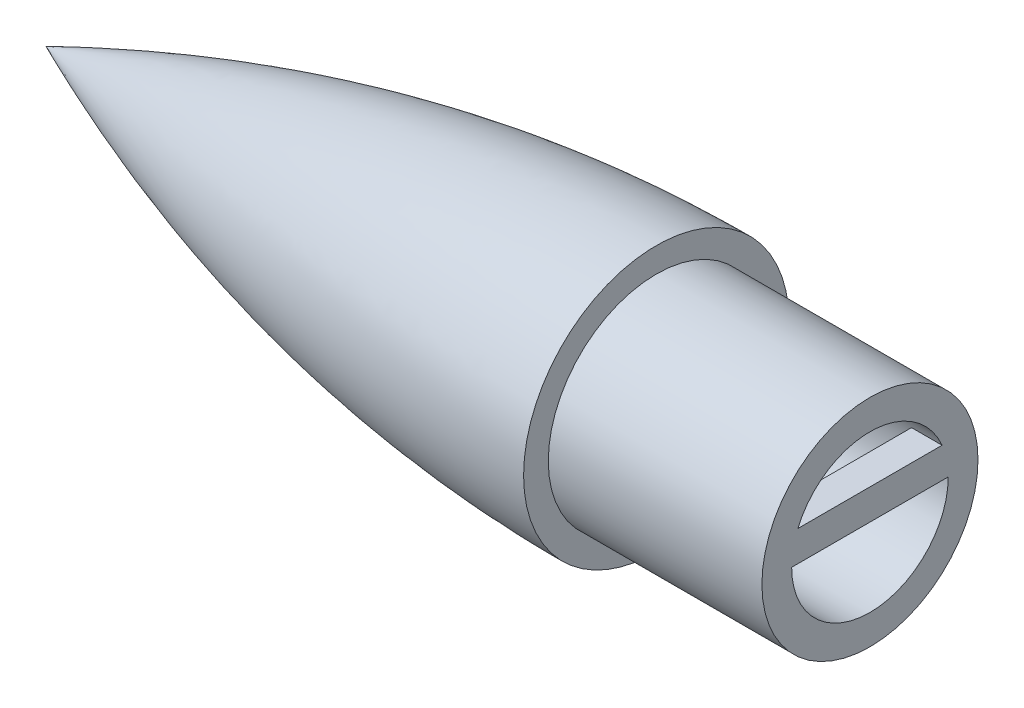
ISO-10303-21;
HEADER;
FILE_DESCRIPTION(('STEP AP214'),'2;1');
FILE_NAME('part.step','',(''),(''),'','','');
FILE_SCHEMA(('AUTOMOTIVE_DESIGN { 1 0 10303 214 1 1 1 1 }'));
ENDSEC;
DATA;
#1=APPLICATION_CONTEXT('core data for automotive mechanical design processes');
#2=APPLICATION_PROTOCOL_DEFINITION('international standard','automotive_design',2000,#1);
#3=PRODUCT_CONTEXT('',#1,'mechanical');
#4=PRODUCT('Part','Part','',(#3));
#5=PRODUCT_RELATED_PRODUCT_CATEGORY('part','',(#4));
#6=PRODUCT_DEFINITION_FORMATION('','',#4);
#7=PRODUCT_DEFINITION_CONTEXT('part definition',#1,'design');
#8=PRODUCT_DEFINITION('design','',#6,#7);
#9=PRODUCT_DEFINITION_SHAPE('','',#8);
#10=(LENGTH_UNIT() NAMED_UNIT(*) SI_UNIT(.MILLI.,.METRE.));
#11=(NAMED_UNIT(*) PLANE_ANGLE_UNIT() SI_UNIT($,.RADIAN.));
#12=(NAMED_UNIT(*) SI_UNIT($,.STERADIAN.) SOLID_ANGLE_UNIT());
#13=UNCERTAINTY_MEASURE_WITH_UNIT(LENGTH_MEASURE(1.E-05),#10,'distance_accuracy_value','');
#14=(GEOMETRIC_REPRESENTATION_CONTEXT(3) GLOBAL_UNCERTAINTY_ASSIGNED_CONTEXT((#13)) GLOBAL_UNIT_ASSIGNED_CONTEXT((#10,
#11,#12)) REPRESENTATION_CONTEXT('',''));
#15=CARTESIAN_POINT('',(0.,0.,0.));
#16=DIRECTION('',(0.,0.,1.));
#17=DIRECTION('',(1.,0.,0.));
#18=AXIS2_PLACEMENT_3D('',#15,#16,#17);
#19=CARTESIAN_POINT('',(46.9899999999181,0.,0.));
#20=DIRECTION('',(1.,0.,0.));
#21=DIRECTION('',(0.,0.,-1.));
#22=AXIS2_PLACEMENT_3D('',#19,#20,#21);
#23=CYLINDRICAL_SURFACE('',#22,6.51699999974734);
#24=CARTESIAN_POINT('',(46.9899999999181,0.,0.));
#25=DIRECTION('',(1.,0.,0.));
#26=DIRECTION('',(0.,0.,-1.));
#27=AXIS2_PLACEMENT_3D('',#24,#25,#26);
#28=CIRCLE('',#27,6.51699999974734);
#29=CARTESIAN_POINT('',(46.9899999999181,0.,-6.51699999974734));
#30=VERTEX_POINT('',#29);
#31=EDGE_CURVE('E71',#30,#30,#28,.T.);
#32=ORIENTED_EDGE('',*,*,#31,.F.);
#33=EDGE_LOOP('',(#32));
#34=FACE_BOUND('',#33,.T.);
#35=DIRECTION('',(1.,0.,0.));
#36=VECTOR('',#35,1.);
#37=CARTESIAN_POINT('',(46.9899999999181,2.54,6.00164052544859));
#38=LINE('',#37,#36);
#39=CARTESIAN_POINT('',(68.5799999999182,2.54,6.00164052544859));
#40=VERTEX_POINT('',#39);
#41=CARTESIAN_POINT('',(66.0399999999182,2.54,6.00164052544859));
#42=VERTEX_POINT('',#41);
#43=EDGE_CURVE('E78',#40,#42,#38,.F.);
#44=ORIENTED_EDGE('',*,*,#43,.T.);
#45=CARTESIAN_POINT('',(66.0399999999182,0.,0.));
#46=DIRECTION('',(1.,0.,0.));
#47=DIRECTION('',(0.,0.,-1.));
#48=AXIS2_PLACEMENT_3D('',#45,#46,#47);
#49=CIRCLE('',#48,6.51699999974734);
#50=CARTESIAN_POINT('',(66.0399999999182,0.,6.51699999974734));
#51=VERTEX_POINT('',#50);
#52=EDGE_CURVE('E82',#42,#51,#49,.T.);
#53=ORIENTED_EDGE('',*,*,#52,.T.);
#54=DIRECTION('',(1.,0.,0.));
#55=VECTOR('',#54,1.);
#56=CARTESIAN_POINT('',(46.9899999999181,0.,6.51699999974734));
#57=LINE('',#56,#55);
#58=CARTESIAN_POINT('',(68.5799999999182,0.,6.51699999974734));
#59=VERTEX_POINT('',#58);
#60=EDGE_CURVE('E127',#51,#59,#57,.T.);
#61=ORIENTED_EDGE('',*,*,#60,.T.);
#62=CARTESIAN_POINT('',(68.5799999999182,0.,0.));
#63=DIRECTION('',(1.,0.,0.));
#64=DIRECTION('',(0.,0.,-1.));
#65=AXIS2_PLACEMENT_3D('',#62,#63,#64);
#66=CIRCLE('',#65,6.51699999974734);
#67=CARTESIAN_POINT('',(68.5799999999182,0.,-6.51699999974734));
#68=VERTEX_POINT('',#67);
#69=EDGE_CURVE('E109',#59,#68,#66,.T.);
#70=ORIENTED_EDGE('',*,*,#69,.T.);
#71=DIRECTION('',(1.,0.,0.));
#72=VECTOR('',#71,1.);
#73=CARTESIAN_POINT('',(46.9899999999181,0.,-6.51699999974734));
#74=LINE('',#73,#72);
#75=CARTESIAN_POINT('',(66.0399999999182,0.,-6.51699999974734));
#76=VERTEX_POINT('',#75);
#77=EDGE_CURVE('E169',#76,#68,#74,.T.);
#78=ORIENTED_EDGE('',*,*,#77,.F.);
#79=CARTESIAN_POINT('',(66.0399999999182,0.,0.));
#80=DIRECTION('',(-1.,0.,0.));
#81=DIRECTION('',(0.,0.,1.));
#82=AXIS2_PLACEMENT_3D('',#79,#80,#81);
#83=CIRCLE('',#82,6.51699999974734);
#84=CARTESIAN_POINT('',(66.0399999999182,2.54,-6.00164052544859));
#85=VERTEX_POINT('',#84);
#86=EDGE_CURVE('E114',#85,#76,#83,.T.);
#87=ORIENTED_EDGE('',*,*,#86,.F.);
#88=DIRECTION('',(1.,0.,0.));
#89=VECTOR('',#88,1.);
#90=CARTESIAN_POINT('',(46.9899999999181,2.54,-6.00164052544859));
#91=LINE('',#90,#89);
#92=CARTESIAN_POINT('',(68.5799999999182,2.54,-6.00164052544859));
#93=VERTEX_POINT('',#92);
#94=EDGE_CURVE('E112',#93,#85,#91,.F.);
#95=ORIENTED_EDGE('',*,*,#94,.F.);
#96=EDGE_CURVE('E102',#93,#40,#66,.T.);
#97=ORIENTED_EDGE('',*,*,#96,.T.);
#98=EDGE_LOOP('',(#44,#53,#61,#70,#78,#87,#95,#97));
#99=FACE_BOUND('',#98,.T.);
#100=ADVANCED_FACE('F63',(#34,#99),#23,.F.);
#101=CARTESIAN_POINT('',(46.9899999999181,0.,0.));
#102=DIRECTION('',(1.,0.,0.));
#103=DIRECTION('',(0.,0.,-1.));
#104=AXIS2_PLACEMENT_3D('',#101,#102,#103);
#105=CYLINDRICAL_SURFACE('',#104,8.99349999974734);
#106=CARTESIAN_POINT('',(46.9899999999181,0.,0.));
#107=DIRECTION('',(1.,0.,0.));
#108=DIRECTION('',(0.,0.,-1.));
#109=AXIS2_PLACEMENT_3D('',#106,#107,#108);
#110=CIRCLE('',#109,8.99349999974734);
#111=CARTESIAN_POINT('',(46.9899999999181,0.,-8.99349999974734));
#112=VERTEX_POINT('',#111);
#113=EDGE_CURVE('E13',#112,#112,#110,.T.);
#114=CARTESIAN_POINT('',(68.5799999999182,0.,0.));
#115=DIRECTION('',(1.,0.,0.));
#116=DIRECTION('',(0.,0.,-1.));
#117=AXIS2_PLACEMENT_3D('',#114,#115,#116);
#118=CIRCLE('',#117,8.99349999974734);
#119=CARTESIAN_POINT('',(68.5799999999181,0.,-8.99349999974734));
#120=VERTEX_POINT('',#119);
#121=EDGE_CURVE('E108',#120,#120,#118,.T.);
#122=CARTESIAN_POINT('',(46.9899999999181,0.,-8.99349999974734));
#123=CARTESIAN_POINT('',(47.2148958332515,0.,-8.99349999974734));
#124=CARTESIAN_POINT('',(47.4397916665848,0.,-8.99349999974734));
#125=CARTESIAN_POINT('',(47.8895833332515,0.,-8.99349999974734));
#126=CARTESIAN_POINT('',(48.1144791665848,0.,-8.99349999974734));
#127=CARTESIAN_POINT('',(48.5642708332515,0.,-8.99349999974734));
#128=CARTESIAN_POINT('',(48.7891666665848,0.,-8.99349999974734));
#129=CARTESIAN_POINT('',(49.2389583332515,0.,-8.99349999974734));
#130=CARTESIAN_POINT('',(49.4638541665848,0.,-8.99349999974734));
#131=CARTESIAN_POINT('',(49.9136458332515,0.,-8.99349999974734));
#132=CARTESIAN_POINT('',(50.1385416665848,0.,-8.99349999974734));
#133=CARTESIAN_POINT('',(50.5883333332515,0.,-8.99349999974734));
#134=CARTESIAN_POINT('',(50.8132291665848,0.,-8.99349999974734));
#135=CARTESIAN_POINT('',(51.2630208332515,0.,-8.99349999974734));
#136=CARTESIAN_POINT('',(51.4879166665848,0.,-8.99349999974734));
#137=CARTESIAN_POINT('',(51.9377083332515,0.,-8.99349999974734));
#138=CARTESIAN_POINT('',(52.1626041665848,0.,-8.99349999974734));
#139=CARTESIAN_POINT('',(52.6123958332515,0.,-8.99349999974734));
#140=CARTESIAN_POINT('',(52.8372916665848,0.,-8.99349999974734));
#141=CARTESIAN_POINT('',(53.2870833332515,0.,-8.99349999974734));
#142=CARTESIAN_POINT('',(53.5119791665848,0.,-8.99349999974734));
#143=CARTESIAN_POINT('',(53.9617708332515,0.,-8.99349999974734));
#144=CARTESIAN_POINT('',(54.1866666665848,0.,-8.99349999974734));
#145=CARTESIAN_POINT('',(54.6364583332515,0.,-8.99349999974734));
#146=CARTESIAN_POINT('',(54.8613541665848,0.,-8.99349999974734));
#147=CARTESIAN_POINT('',(55.3111458332515,0.,-8.99349999974734));
#148=CARTESIAN_POINT('',(55.5360416665848,0.,-8.99349999974734));
#149=CARTESIAN_POINT('',(55.9858333332515,0.,-8.99349999974734));
#150=CARTESIAN_POINT('',(56.2107291665848,0.,-8.99349999974734));
#151=CARTESIAN_POINT('',(56.6605208332515,0.,-8.99349999974734));
#152=CARTESIAN_POINT('',(56.8854166665848,0.,-8.99349999974734));
#153=CARTESIAN_POINT('',(57.3352083332515,0.,-8.99349999974734));
#154=CARTESIAN_POINT('',(57.5601041665848,0.,-8.99349999974734));
#155=CARTESIAN_POINT('',(58.0098958332515,0.,-8.99349999974734));
#156=CARTESIAN_POINT('',(58.2347916665848,0.,-8.99349999974734));
#157=CARTESIAN_POINT('',(58.6845833332515,0.,-8.99349999974734));
#158=CARTESIAN_POINT('',(58.9094791665848,0.,-8.99349999974734));
#159=CARTESIAN_POINT('',(59.3592708332515,0.,-8.99349999974734));
#160=CARTESIAN_POINT('',(59.5841666665848,0.,-8.99349999974734));
#161=CARTESIAN_POINT('',(60.0339583332515,0.,-8.99349999974734));
#162=CARTESIAN_POINT('',(60.2588541665848,0.,-8.99349999974734));
#163=CARTESIAN_POINT('',(60.7086458332515,0.,-8.99349999974734));
#164=CARTESIAN_POINT('',(60.9335416665848,0.,-8.99349999974734));
#165=CARTESIAN_POINT('',(61.3833333332515,0.,-8.99349999974734));
#166=CARTESIAN_POINT('',(61.6082291665848,0.,-8.99349999974734));
#167=CARTESIAN_POINT('',(62.0580208332515,0.,-8.99349999974734));
#168=CARTESIAN_POINT('',(62.2829166665848,0.,-8.99349999974734));
#169=CARTESIAN_POINT('',(62.7327083332515,0.,-8.99349999974734));
#170=CARTESIAN_POINT('',(62.9576041665848,0.,-8.99349999974734));
#171=CARTESIAN_POINT('',(63.4073958332515,0.,-8.99349999974734));
#172=CARTESIAN_POINT('',(63.6322916665848,0.,-8.99349999974734));
#173=CARTESIAN_POINT('',(64.0820833332515,0.,-8.99349999974734));
#174=CARTESIAN_POINT('',(64.3069791665848,0.,-8.99349999974734));
#175=CARTESIAN_POINT('',(64.7567708332515,0.,-8.99349999974734));
#176=CARTESIAN_POINT('',(64.9816666665848,0.,-8.99349999974734));
#177=CARTESIAN_POINT('',(65.4314583332515,0.,-8.99349999974734));
#178=CARTESIAN_POINT('',(65.6563541665848,0.,-8.99349999974734));
#179=CARTESIAN_POINT('',(66.1061458332515,0.,-8.99349999974734));
#180=CARTESIAN_POINT('',(66.3310416665848,0.,-8.99349999974734));
#181=CARTESIAN_POINT('',(66.7808333332515,0.,-8.99349999974734));
#182=CARTESIAN_POINT('',(67.0057291665848,0.,-8.99349999974734));
#183=CARTESIAN_POINT('',(67.4555208332515,0.,-8.99349999974734));
#184=CARTESIAN_POINT('',(67.6804166665848,0.,-8.99349999974734));
#185=CARTESIAN_POINT('',(68.1302083332515,0.,-8.99349999974734));
#186=CARTESIAN_POINT('',(68.3551041665848,0.,-8.99349999974734));
#187=CARTESIAN_POINT('',(68.5799999999181,0.,-8.99349999974734));
#188=B_SPLINE_CURVE_WITH_KNOTS('',3,(#122,#123,#124,#125,#126,#127,#128,#129,#130,#131,#132,
#133,#134,#135,#136,#137,#138,#139,#140,#141,#142,#143,#144,#145,#146,#147,#148,#149,#150,#151,
#152,#153,#154,#155,#156,#157,#158,#159,#160,#161,#162,#163,#164,#165,#166,#167,#168,#169,#170,
#171,#172,#173,#174,#175,#176,#177,#178,#179,#180,#181,#182,#183,#184,#185,#186,#187),
.UNSPECIFIED.,.F.,.F.,(4,2,2,2,2,2,2,2,2,2,2,2,2,2,2,2,2,2,2,2,2,2,2,2,2,2,2,2,2,2,2,2,4),(0.,
0.674687500000007,1.349375,2.02406250000001,2.69875,3.37343750000001,4.048125,4.72281250000001,
5.3975,6.07218750000001,6.746875,7.42156250000001,8.09625,8.77093750000001,9.445625,10.1203125,
10.795,11.4696875,12.144375,12.8190625,13.49375,14.1684375,14.843125,15.5178125,16.1925,
16.8671875,17.541875,18.2165625,18.89125,19.5659375,20.240625,20.9153125,21.59),.UNSPECIFIED.);
#189=EDGE_CURVE('BSEAM65',#112,#120,#188,.T.);
#190=ORIENTED_EDGE('',*,*,#113,.T.);
#191=ORIENTED_EDGE('',*,*,#121,.F.);
#192=ORIENTED_EDGE('',*,*,#189,.T.);
#193=ORIENTED_EDGE('',*,*,#189,.F.);
#194=EDGE_LOOP('',(#190,#192,#191,#193));
#195=FACE_BOUND('',#194,.T.);
#196=ADVANCED_FACE('F65',(#195),#105,.T.);
#197=CARTESIAN_POINT('',(46.9899999999181,0.,0.));
#198=DIRECTION('',(1.,0.,0.));
#199=DIRECTION('',(0.,0.,-1.));
#200=AXIS2_PLACEMENT_3D('',#197,#198,#199);
#201=PLANE('',#200);
#202=ORIENTED_EDGE('',*,*,#31,.T.);
#203=EDGE_LOOP('',(#202));
#204=FACE_BOUND('',#203,.T.);
#205=ORIENTED_EDGE('',*,*,#113,.F.);
#206=EDGE_LOOP('',(#205));
#207=FACE_BOUND('',#206,.T.);
#208=ADVANCED_FACE('F133',(#204,#207),#201,.F.);
#209=CARTESIAN_POINT('',(68.5799999999182,0.,0.));
#210=DIRECTION('',(1.,0.,0.));
#211=DIRECTION('',(0.,0.,-1.));
#212=AXIS2_PLACEMENT_3D('',#209,#210,#211);
#213=PLANE('',#212);
#214=DIRECTION('',(0.,0.,-1.));
#215=VECTOR('',#214,1.);
#216=CARTESIAN_POINT('',(68.5799999999182,2.54,11.0499999997905));
#217=LINE('',#216,#215);
#218=EDGE_CURVE('E107',#40,#93,#217,.T.);
#219=ORIENTED_EDGE('',*,*,#218,.F.);
#220=ORIENTED_EDGE('',*,*,#96,.F.);
#221=EDGE_LOOP('',(#219,#220));
#222=FACE_BOUND('',#221,.T.);
#223=ORIENTED_EDGE('',*,*,#121,.T.);
#224=EDGE_LOOP('',(#223));
#225=FACE_BOUND('',#224,.T.);
#226=ORIENTED_EDGE('',*,*,#69,.F.);
#227=DIRECTION('',(0.,0.,-1.));
#228=VECTOR('',#227,1.);
#229=CARTESIAN_POINT('',(68.5799999999182,0.,11.0499999997905));
#230=LINE('',#229,#228);
#231=EDGE_CURVE('E168',#59,#68,#230,.T.);
#232=ORIENTED_EDGE('',*,*,#231,.T.);
#233=EDGE_LOOP('',(#226,#232));
#234=FACE_BOUND('',#233,.T.);
#235=ADVANCED_FACE('F104',(#222,#225,#234),#213,.T.);
#236=CARTESIAN_POINT('',(68.5799999999182,2.54,11.0499999997905));
#237=DIRECTION('',(0.,-1.,0.));
#238=DIRECTION('',(1.,0.,0.));
#239=AXIS2_PLACEMENT_3D('',#236,#237,#238);
#240=PLANE('',#239);
#241=ORIENTED_EDGE('',*,*,#43,.F.);
#242=ORIENTED_EDGE('',*,*,#218,.T.);
#243=ORIENTED_EDGE('',*,*,#94,.T.);
#244=DIRECTION('',(0.,0.,-1.));
#245=VECTOR('',#244,1.);
#246=CARTESIAN_POINT('',(66.0399999999182,2.54,11.0499999997905));
#247=LINE('',#246,#245);
#248=EDGE_CURVE('E120',#42,#85,#247,.T.);
#249=ORIENTED_EDGE('',*,*,#248,.F.);
#250=EDGE_LOOP('',(#241,#242,#243,#249));
#251=FACE_BOUND('',#250,.T.);
#252=ADVANCED_FACE('F119',(#251),#240,.F.);
#253=CARTESIAN_POINT('',(66.0399999999182,0.,11.0499999997905));
#254=DIRECTION('',(1.,0.,0.));
#255=DIRECTION('',(0.,0.,-1.));
#256=AXIS2_PLACEMENT_3D('',#253,#254,#255);
#257=PLANE('',#256);
#258=ORIENTED_EDGE('',*,*,#52,.F.);
#259=ORIENTED_EDGE('',*,*,#248,.T.);
#260=ORIENTED_EDGE('',*,*,#86,.T.);
#261=DIRECTION('',(0.,0.,-1.));
#262=VECTOR('',#261,1.);
#263=CARTESIAN_POINT('',(66.0399999999182,0.,11.0499999997905));
#264=LINE('',#263,#262);
#265=EDGE_CURVE('E123',#51,#76,#264,.T.);
#266=ORIENTED_EDGE('',*,*,#265,.F.);
#267=EDGE_LOOP('',(#258,#259,#260,#266));
#268=FACE_BOUND('',#267,.T.);
#269=ADVANCED_FACE('F151',(#268),#257,.F.);
#270=CARTESIAN_POINT('',(68.5799999999182,0.,11.0499999997905));
#271=DIRECTION('',(0.,1.,0.));
#272=DIRECTION('',(-1.,0.,0.));
#273=AXIS2_PLACEMENT_3D('',#270,#271,#272);
#274=PLANE('',#273);
#275=ORIENTED_EDGE('',*,*,#60,.F.);
#276=ORIENTED_EDGE('',*,*,#265,.T.);
#277=ORIENTED_EDGE('',*,*,#77,.T.);
#278=ORIENTED_EDGE('',*,*,#231,.F.);
#279=EDGE_LOOP('',(#275,#276,#277,#278));
#280=FACE_BOUND('',#279,.T.);
#281=ADVANCED_FACE('F155',(#280),#274,.F.);
#282=CLOSED_SHELL('',(#100,#196,#208,#235,#252,#269,#281));
#283=MANIFOLD_SOLID_BREP('B2',#282);
#284=CARTESIAN_POINT('',(50.7999999998931,0.,-11.0489999997473));
#285=CARTESIAN_POINT('',(25.3999999999805,0.,-11.0489999998337));
#286=CARTESIAN_POINT('',(4.34027813689397E-12,0.,3.98606928714296E-12));
#287=B_SPLINE_CURVE_WITH_KNOTS('',2,(#284,#285,#286),.UNSPECIFIED.,.F.,.F.,(3,3),
(0.078632983887804,0.916239362167247),.UNSPECIFIED.);
#288=CARTESIAN_POINT('',(50.7999999999181,0.,0.));
#289=DIRECTION('',(1.,0.,0.));
#290=AXIS1_PLACEMENT('',#288,#289);
#291=SURFACE_OF_REVOLUTION('',#287,#290);
#292=CARTESIAN_POINT('',(1.34909444726716E-11,0.,0.));
#293=VERTEX_POINT('',#292);
#294=VERTEX_LOOP('',#293);
#295=FACE_BOUND('',#294,.T.);
#296=CARTESIAN_POINT('',(50.7999999999181,0.,0.));
#297=DIRECTION('',(1.,0.,0.));
#298=DIRECTION('',(0.,0.,-1.));
#299=AXIS2_PLACEMENT_3D('',#296,#297,#298);
#300=CIRCLE('',#299,11.0489999997474);
#301=CARTESIAN_POINT('',(50.7999999999181,0.,-11.0489999997474));
#302=VERTEX_POINT('',#301);
#303=EDGE_CURVE('E61',#302,#302,#300,.T.);
#304=ORIENTED_EDGE('',*,*,#303,.F.);
#305=EDGE_LOOP('',(#304));
#306=FACE_BOUND('',#305,.T.);
#307=ADVANCED_FACE('F229',(#295,#306),#291,.F.);
#308=CARTESIAN_POINT('',(50.7999999999181,0.,-11.0489999997474));
#309=DIRECTION('',(1.,0.,0.));
#310=DIRECTION('',(0.,0.,-1.));
#311=AXIS2_PLACEMENT_3D('',#308,#309,#310);
#312=PLANE('',#311);
#313=CARTESIAN_POINT('',(50.7999999998511,0.,0.));
#314=DIRECTION('',(1.,0.,0.));
#315=DIRECTION('',(0.,0.,-1.));
#316=AXIS2_PLACEMENT_3D('',#313,#314,#315);
#317=CIRCLE('',#316,8.54899999974734);
#318=CARTESIAN_POINT('',(50.7999999998511,0.,-8.54899999974734));
#319=VERTEX_POINT('',#318);
#320=EDGE_CURVE('E236',#319,#319,#317,.T.);
#321=ORIENTED_EDGE('',*,*,#320,.F.);
#322=EDGE_LOOP('',(#321));
#323=FACE_BOUND('',#322,.T.);
#324=ORIENTED_EDGE('',*,*,#303,.T.);
#325=EDGE_LOOP('',(#324));
#326=FACE_BOUND('',#325,.T.);
#327=ADVANCED_FACE('F245',(#323,#326),#312,.T.);
#328=CARTESIAN_POINT('',(50.7999999998931,0.,-11.0489999997473));
#329=CARTESIAN_POINT('',(28.2391147223149,0.,-11.048999999824));
#330=CARTESIAN_POINT('',(5.67822944468667,0.,-2.33198457230232));
#331=B_SPLINE_CURVE_WITH_KNOTS('',2,(#328,#329,#330),.UNSPECIFIED.,.F.,.F.,(3,3),
(0.078632983887804,0.822614929092342),.UNSPECIFIED.);
#332=CARTESIAN_POINT('',(50.7999999999181,0.,0.));
#333=DIRECTION('',(1.,0.,0.));
#334=AXIS1_PLACEMENT('',#332,#333);
#335=SURFACE_OF_REVOLUTION('',#331,#334);
#336=OFFSET_SURFACE('',#335,2.5,.F.);
#337=CARTESIAN_POINT('',(6.57925550121555,0.,0.));
#338=VERTEX_POINT('',#337);
#339=VERTEX_LOOP('',#338);
#340=FACE_BOUND('',#339,.T.);
#341=ORIENTED_EDGE('',*,*,#320,.T.);
#342=EDGE_LOOP('',(#341));
#343=FACE_BOUND('',#342,.T.);
#344=ADVANCED_FACE('F242',(#340,#343),#336,.T.);
#345=CLOSED_SHELL('',(#307,#327,#344));
#346=MANIFOLD_SOLID_BREP('B7',#345);
#347=ADVANCED_BREP_SHAPE_REPRESENTATION('',(#18,#283,#346),#14);
#348=SHAPE_DEFINITION_REPRESENTATION(#9,#347);
ENDSEC;
END-ISO-10303-21;
